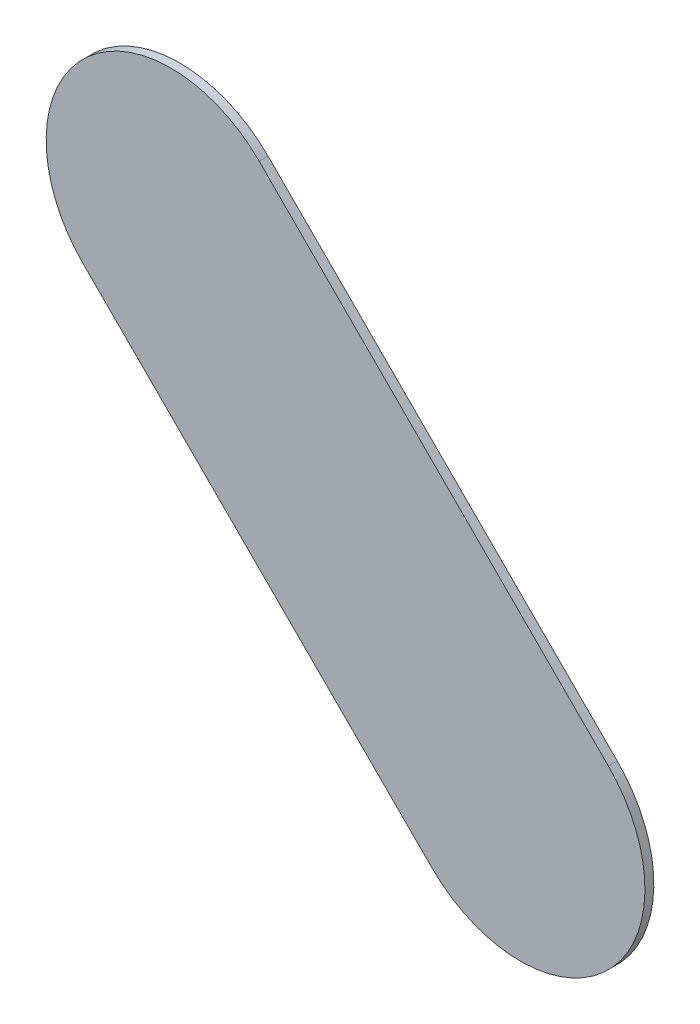
ISO-10303-21;
HEADER;
FILE_DESCRIPTION(('STEP AP214'),'2;1');
FILE_NAME('part.step','',(''),(''),'','','');
FILE_SCHEMA(('AUTOMOTIVE_DESIGN { 1 0 10303 214 1 1 1 1 }'));
ENDSEC;
DATA;
#1=APPLICATION_CONTEXT('core data for automotive mechanical design processes');
#2=APPLICATION_PROTOCOL_DEFINITION('international standard','automotive_design',2000,#1);
#3=PRODUCT_CONTEXT('',#1,'mechanical');
#4=PRODUCT('Part','Part','',(#3));
#5=PRODUCT_RELATED_PRODUCT_CATEGORY('part','',(#4));
#6=PRODUCT_DEFINITION_FORMATION('','',#4);
#7=PRODUCT_DEFINITION_CONTEXT('part definition',#1,'design');
#8=PRODUCT_DEFINITION('design','',#6,#7);
#9=PRODUCT_DEFINITION_SHAPE('','',#8);
#10=(LENGTH_UNIT() NAMED_UNIT(*) SI_UNIT(.MILLI.,.METRE.));
#11=(NAMED_UNIT(*) PLANE_ANGLE_UNIT() SI_UNIT($,.RADIAN.));
#12=(NAMED_UNIT(*) SI_UNIT($,.STERADIAN.) SOLID_ANGLE_UNIT());
#13=UNCERTAINTY_MEASURE_WITH_UNIT(LENGTH_MEASURE(1.E-05),#10,'distance_accuracy_value','');
#14=(GEOMETRIC_REPRESENTATION_CONTEXT(3) GLOBAL_UNCERTAINTY_ASSIGNED_CONTEXT((#13)) GLOBAL_UNIT_ASSIGNED_CONTEXT((#10,
#11,#12)) REPRESENTATION_CONTEXT('',''));
#15=CARTESIAN_POINT('',(0.,0.,0.));
#16=DIRECTION('',(0.,0.,1.));
#17=DIRECTION('',(1.,0.,0.));
#18=AXIS2_PLACEMENT_3D('',#15,#16,#17);
#19=CARTESIAN_POINT('',(57.06644924,50.70344444,0.));
#20=DIRECTION('',(0.707106781186549,0.707106781186546,0.));
#21=DIRECTION('',(0.707106781186546,-0.707106781186549,0.));
#22=AXIS2_PLACEMENT_3D('',#19,#20,#21);
#23=PLANE('',#22);
#24=DIRECTION('',(0.707106781186546,-0.707106781186549,0.));
#25=VECTOR('',#24,1.);
#26=CARTESIAN_POINT('',(57.06644924,50.70344444,0.03556));
#27=LINE('',#26,#25);
#28=CARTESIAN_POINT('',(57.06644924,50.70344444,0.03556));
#29=VERTEX_POINT('',#28);
#30=CARTESIAN_POINT('',(58.46644644,49.30344724,0.03556));
#31=VERTEX_POINT('',#30);
#32=EDGE_CURVE('E11',#29,#31,#27,.T.);
#33=ORIENTED_EDGE('',*,*,#32,.F.);
#34=DIRECTION('',(0.,0.,1.));
#35=VECTOR('',#34,1.);
#36=CARTESIAN_POINT('',(57.06644924,50.70344444,0.));
#37=LINE('',#36,#35);
#38=CARTESIAN_POINT('',(57.06644924,50.70344444,0.));
#39=VERTEX_POINT('',#38);
#40=EDGE_CURVE('E24',#39,#29,#37,.T.);
#41=ORIENTED_EDGE('',*,*,#40,.F.);
#42=DIRECTION('',(0.707106781186546,-0.707106781186549,0.));
#43=VECTOR('',#42,1.);
#44=CARTESIAN_POINT('',(57.06644924,50.70344444,0.));
#45=LINE('',#44,#43);
#46=CARTESIAN_POINT('',(58.46644644,49.30344724,0.));
#47=VERTEX_POINT('',#46);
#48=EDGE_CURVE('E75',#39,#47,#45,.T.);
#49=ORIENTED_EDGE('',*,*,#48,.T.);
#50=DIRECTION('',(0.,0.,1.));
#51=VECTOR('',#50,1.);
#52=CARTESIAN_POINT('',(58.46644644,49.30344724,0.));
#53=LINE('',#52,#51);
#54=EDGE_CURVE('E37',#47,#31,#53,.T.);
#55=ORIENTED_EDGE('',*,*,#54,.T.);
#56=EDGE_LOOP('',(#33,#41,#49,#55));
#57=FACE_BOUND('',#56,.T.);
#58=ADVANCED_FACE('F17',(#57),#23,.F.);
#59=CARTESIAN_POINT('',(58.8199992,49.657,0.));
#60=DIRECTION('',(0.,0.,-1.));
#61=DIRECTION('',(-0.707106781186555,-0.70710678118654,0.));
#62=AXIS2_PLACEMENT_3D('',#59,#60,#61);
#63=CYLINDRICAL_SURFACE('',#62,0.499999108206441);
#64=CARTESIAN_POINT('',(58.8199992,49.657,0.03556));
#65=DIRECTION('',(0.,0.,1.));
#66=DIRECTION('',(-0.707106781186555,-0.70710678118654,0.));
#67=AXIS2_PLACEMENT_3D('',#64,#65,#66);
#68=CIRCLE('',#67,0.499999108206441);
#69=CARTESIAN_POINT('',(59.17355196,50.01055276,0.03556));
#70=VERTEX_POINT('',#69);
#71=EDGE_CURVE('E83',#31,#70,#68,.T.);
#72=ORIENTED_EDGE('',*,*,#71,.F.);
#73=ORIENTED_EDGE('',*,*,#54,.F.);
#74=CARTESIAN_POINT('',(58.8199992,49.657,0.));
#75=DIRECTION('',(0.,0.,1.));
#76=DIRECTION('',(-0.707106781186555,-0.70710678118654,0.));
#77=AXIS2_PLACEMENT_3D('',#74,#75,#76);
#78=CIRCLE('',#77,0.499999108206441);
#79=CARTESIAN_POINT('',(59.17355196,50.01055276,0.));
#80=VERTEX_POINT('',#79);
#81=EDGE_CURVE('E81',#47,#80,#78,.T.);
#82=ORIENTED_EDGE('',*,*,#81,.T.);
#83=DIRECTION('',(0.,0.,1.));
#84=VECTOR('',#83,1.);
#85=CARTESIAN_POINT('',(59.17355196,50.01055276,0.));
#86=LINE('',#85,#84);
#87=EDGE_CURVE('E67',#80,#70,#86,.T.);
#88=ORIENTED_EDGE('',*,*,#87,.T.);
#89=EDGE_LOOP('',(#72,#73,#82,#88));
#90=FACE_BOUND('',#89,.T.);
#91=ADVANCED_FACE('F89',(#90),#63,.T.);
#92=CARTESIAN_POINT('',(59.17355196,50.01055276,0.));
#93=DIRECTION('',(-0.707106781186548,-0.707106781186548,0.));
#94=DIRECTION('',(-0.707106781186548,0.707106781186548,0.));
#95=AXIS2_PLACEMENT_3D('',#92,#93,#94);
#96=PLANE('',#95);
#97=DIRECTION('',(-0.707106781186548,0.707106781186548,0.));
#98=VECTOR('',#97,1.);
#99=CARTESIAN_POINT('',(59.17355196,50.01055276,0.03556));
#100=LINE('',#99,#98);
#101=CARTESIAN_POINT('',(57.77355476,51.41054996,0.03556));
#102=VERTEX_POINT('',#101);
#103=EDGE_CURVE('E71',#70,#102,#100,.T.);
#104=ORIENTED_EDGE('',*,*,#103,.F.);
#105=ORIENTED_EDGE('',*,*,#87,.F.);
#106=DIRECTION('',(-0.707106781186548,0.707106781186548,0.));
#107=VECTOR('',#106,1.);
#108=CARTESIAN_POINT('',(59.17355196,50.01055276,0.));
#109=LINE('',#108,#107);
#110=CARTESIAN_POINT('',(57.77355476,51.41054996,0.));
#111=VERTEX_POINT('',#110);
#112=EDGE_CURVE('E63',#80,#111,#109,.T.);
#113=ORIENTED_EDGE('',*,*,#112,.T.);
#114=DIRECTION('',(0.,0.,1.));
#115=VECTOR('',#114,1.);
#116=CARTESIAN_POINT('',(57.77355476,51.41054996,0.));
#117=LINE('',#116,#115);
#118=EDGE_CURVE('E53',#111,#102,#117,.T.);
#119=ORIENTED_EDGE('',*,*,#118,.T.);
#120=EDGE_LOOP('',(#104,#105,#113,#119));
#121=FACE_BOUND('',#120,.T.);
#122=ADVANCED_FACE('F66',(#121),#96,.F.);
#123=CARTESIAN_POINT('',(57.420002,51.0569972,0.));
#124=DIRECTION('',(0.,0.,-1.));
#125=DIRECTION('',(0.707106781186548,0.707106781186548,0.));
#126=AXIS2_PLACEMENT_3D('',#123,#124,#125);
#127=CYLINDRICAL_SURFACE('',#126,0.499999108206439);
#128=CARTESIAN_POINT('',(57.420002,51.0569972,0.03556));
#129=DIRECTION('',(0.,0.,1.));
#130=DIRECTION('',(0.707106781186548,0.707106781186548,0.));
#131=AXIS2_PLACEMENT_3D('',#128,#129,#130);
#132=CIRCLE('',#131,0.499999108206439);
#133=EDGE_CURVE('E59',#102,#29,#132,.T.);
#134=ORIENTED_EDGE('',*,*,#133,.F.);
#135=ORIENTED_EDGE('',*,*,#118,.F.);
#136=CARTESIAN_POINT('',(57.420002,51.0569972,0.));
#137=DIRECTION('',(0.,0.,1.));
#138=DIRECTION('',(0.707106781186548,0.707106781186548,0.));
#139=AXIS2_PLACEMENT_3D('',#136,#137,#138);
#140=CIRCLE('',#139,0.499999108206439);
#141=EDGE_CURVE('E57',#111,#39,#140,.T.);
#142=ORIENTED_EDGE('',*,*,#141,.T.);
#143=ORIENTED_EDGE('',*,*,#40,.T.);
#144=EDGE_LOOP('',(#134,#135,#142,#143));
#145=FACE_BOUND('',#144,.T.);
#146=ADVANCED_FACE('F55',(#145),#127,.T.);
#147=CARTESIAN_POINT('',(57.06644924,50.70344444,0.));
#148=DIRECTION('',(0.,0.,-1.));
#149=DIRECTION('',(-1.,0.,0.));
#150=AXIS2_PLACEMENT_3D('',#147,#148,#149);
#151=PLANE('',#150);
#152=ORIENTED_EDGE('',*,*,#141,.F.);
#153=ORIENTED_EDGE('',*,*,#112,.F.);
#154=ORIENTED_EDGE('',*,*,#81,.F.);
#155=ORIENTED_EDGE('',*,*,#48,.F.);
#156=EDGE_LOOP('',(#152,#153,#154,#155));
#157=FACE_BOUND('',#156,.T.);
#158=ADVANCED_FACE('F74',(#157),#151,.T.);
#159=CARTESIAN_POINT('',(57.06644924,50.70344444,0.03556));
#160=DIRECTION('',(0.,0.,-1.));
#161=DIRECTION('',(-1.,0.,0.));
#162=AXIS2_PLACEMENT_3D('',#159,#160,#161);
#163=PLANE('',#162);
#164=ORIENTED_EDGE('',*,*,#32,.T.);
#165=ORIENTED_EDGE('',*,*,#71,.T.);
#166=ORIENTED_EDGE('',*,*,#103,.T.);
#167=ORIENTED_EDGE('',*,*,#133,.T.);
#168=EDGE_LOOP('',(#164,#165,#166,#167));
#169=FACE_BOUND('',#168,.T.);
#170=ADVANCED_FACE('F91',(#169),#163,.F.);
#171=CLOSED_SHELL('',(#58,#91,#122,#146,#158,#170));
#172=MANIFOLD_SOLID_BREP('B1',#171);
#173=ADVANCED_BREP_SHAPE_REPRESENTATION('',(#18,#172),#14);
#174=SHAPE_DEFINITION_REPRESENTATION(#9,#173);
ENDSEC;
END-ISO-10303-21;
